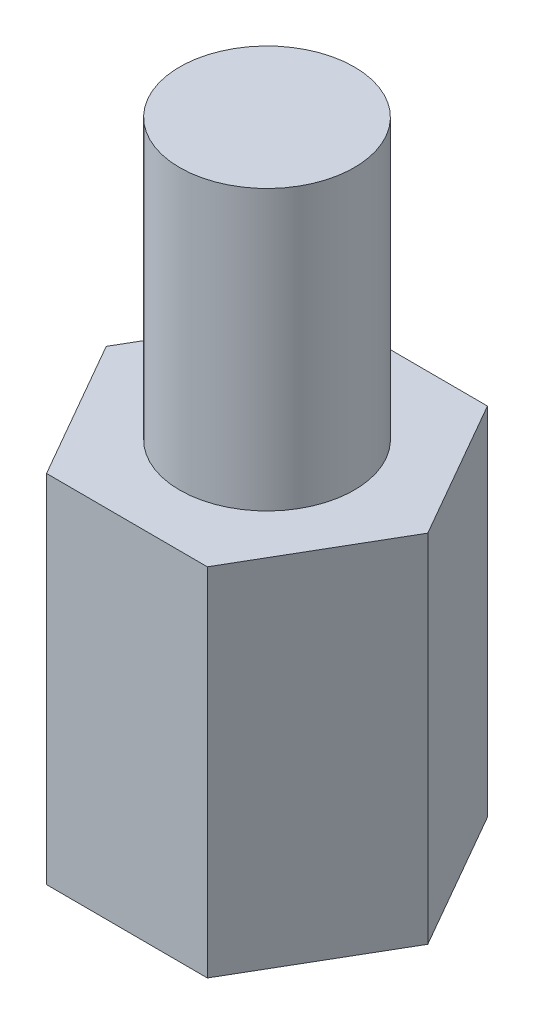
ISO-10303-21;
HEADER;
FILE_DESCRIPTION(('STEP AP214'),'2;1');
FILE_NAME('part.step','',(''),(''),'','','');
FILE_SCHEMA(('AUTOMOTIVE_DESIGN { 1 0 10303 214 1 1 1 1 }'));
ENDSEC;
DATA;
#1=APPLICATION_CONTEXT('core data for automotive mechanical design processes');
#2=APPLICATION_PROTOCOL_DEFINITION('international standard','automotive_design',2000,#1);
#3=PRODUCT_CONTEXT('',#1,'mechanical');
#4=PRODUCT('Part','Part','',(#3));
#5=PRODUCT_RELATED_PRODUCT_CATEGORY('part','',(#4));
#6=PRODUCT_DEFINITION_FORMATION('','',#4);
#7=PRODUCT_DEFINITION_CONTEXT('part definition',#1,'design');
#8=PRODUCT_DEFINITION('design','',#6,#7);
#9=PRODUCT_DEFINITION_SHAPE('','',#8);
#10=(LENGTH_UNIT() NAMED_UNIT(*) SI_UNIT(.MILLI.,.METRE.));
#11=(NAMED_UNIT(*) PLANE_ANGLE_UNIT() SI_UNIT($,.RADIAN.));
#12=(NAMED_UNIT(*) SI_UNIT($,.STERADIAN.) SOLID_ANGLE_UNIT());
#13=UNCERTAINTY_MEASURE_WITH_UNIT(LENGTH_MEASURE(1.E-05),#10,'distance_accuracy_value','');
#14=(GEOMETRIC_REPRESENTATION_CONTEXT(3) GLOBAL_UNCERTAINTY_ASSIGNED_CONTEXT((#13)) GLOBAL_UNIT_ASSIGNED_CONTEXT((#10,
#11,#12)) REPRESENTATION_CONTEXT('',''));
#15=CARTESIAN_POINT('',(0.,0.,0.));
#16=DIRECTION('',(0.,0.,1.));
#17=DIRECTION('',(1.,0.,0.));
#18=AXIS2_PLACEMENT_3D('',#15,#16,#17);
#19=CARTESIAN_POINT('',(2.30939087048754,5.1,0.00686590431880863));
#20=DIRECTION('',(-0.86750808832284,0.,0.497423076157965));
#21=DIRECTION('',(0.497423076157965,0.,0.86750808832284));
#22=AXIS2_PLACEMENT_3D('',#19,#20,#21);
#23=PLANE('',#22);
#24=DIRECTION('',(-0.497423076157965,0.,-0.867508088322839));
#25=VECTOR('',#24,1.);
#26=CARTESIAN_POINT('',(2.30939087048754,0.,0.00686590431880863));
#27=LINE('',#26,#25);
#28=CARTESIAN_POINT('',(2.30939087048754,0.,0.00686590431880863));
#29=VERTEX_POINT('',#28);
#30=CARTESIAN_POINT('',(1.16064148280381,0.,-1.99655820895067));
#31=VERTEX_POINT('',#30);
#32=EDGE_CURVE('E119',#29,#31,#27,.T.);
#33=ORIENTED_EDGE('',*,*,#32,.T.);
#34=DIRECTION('',(0.,-1.,0.));
#35=VECTOR('',#34,1.);
#36=CARTESIAN_POINT('',(1.16064148280381,5.1,-1.99655820895067));
#37=LINE('',#36,#35);
#38=CARTESIAN_POINT('',(1.16064148280381,5.1,-1.99655820895067));
#39=VERTEX_POINT('',#38);
#40=EDGE_CURVE('E36',#39,#31,#37,.T.);
#41=ORIENTED_EDGE('',*,*,#40,.F.);
#42=DIRECTION('',(-0.497423076157965,0.,-0.867508088322839));
#43=VECTOR('',#42,1.);
#44=CARTESIAN_POINT('',(2.30939087048754,5.1,0.00686590431880863));
#45=LINE('',#44,#43);
#46=CARTESIAN_POINT('',(2.30939087048754,5.1,0.00686590431880863));
#47=VERTEX_POINT('',#46);
#48=EDGE_CURVE('E130',#47,#39,#45,.T.);
#49=ORIENTED_EDGE('',*,*,#48,.F.);
#50=DIRECTION('',(0.,-1.,0.));
#51=VECTOR('',#50,1.);
#52=CARTESIAN_POINT('',(2.30939087048754,5.1,0.00686590431880863));
#53=LINE('',#52,#51);
#54=EDGE_CURVE('E115',#47,#29,#53,.T.);
#55=ORIENTED_EDGE('',*,*,#54,.T.);
#56=EDGE_LOOP('',(#33,#41,#49,#55));
#57=FACE_BOUND('',#56,.T.);
#58=ADVANCED_FACE('F33',(#57),#23,.F.);
#59=CARTESIAN_POINT('',(1.16064148280381,5.1,-1.99655820895067));
#60=DIRECTION('',(-0.00297302378002078,0.,0.999995580555036));
#61=DIRECTION('',(0.999995580555036,0.,0.00297302378002079));
#62=AXIS2_PLACEMENT_3D('',#59,#60,#61);
#63=PLANE('',#62);
#64=DIRECTION('',(-0.999995580555036,0.,-0.00297302378002078));
#65=VECTOR('',#64,1.);
#66=CARTESIAN_POINT('',(1.16064148280381,0.,-1.99655820895067));
#67=LINE('',#66,#65);
#68=CARTESIAN_POINT('',(-1.14874938768373,0.,-2.00342411326948));
#69=VERTEX_POINT('',#68);
#70=EDGE_CURVE('E122',#31,#69,#67,.T.);
#71=ORIENTED_EDGE('',*,*,#70,.T.);
#72=DIRECTION('',(0.,-1.,0.));
#73=VECTOR('',#72,1.);
#74=CARTESIAN_POINT('',(-1.14874938768373,5.1,-2.00342411326948));
#75=LINE('',#74,#73);
#76=CARTESIAN_POINT('',(-1.14874938768373,5.1,-2.00342411326948));
#77=VERTEX_POINT('',#76);
#78=EDGE_CURVE('E133',#77,#69,#75,.T.);
#79=ORIENTED_EDGE('',*,*,#78,.F.);
#80=DIRECTION('',(-0.999995580555036,0.,-0.00297302378002078));
#81=VECTOR('',#80,1.);
#82=CARTESIAN_POINT('',(1.16064148280381,5.1,-1.99655820895067));
#83=LINE('',#82,#81);
#84=EDGE_CURVE('E88',#39,#77,#83,.T.);
#85=ORIENTED_EDGE('',*,*,#84,.F.);
#86=ORIENTED_EDGE('',*,*,#40,.T.);
#87=EDGE_LOOP('',(#71,#79,#85,#86));
#88=FACE_BOUND('',#87,.T.);
#89=ADVANCED_FACE('F138',(#88),#63,.F.);
#90=CARTESIAN_POINT('',(-1.14874938768373,5.1,-2.00342411326948));
#91=DIRECTION('',(0.864535064542819,0.,0.502572504397071));
#92=DIRECTION('',(0.502572504397071,0.,-0.864535064542819));
#93=AXIS2_PLACEMENT_3D('',#90,#91,#92);
#94=PLANE('',#93);
#95=DIRECTION('',(-0.502572504397071,0.,0.864535064542819));
#96=VECTOR('',#95,1.);
#97=CARTESIAN_POINT('',(-1.14874938768373,0.,-2.00342411326948));
#98=LINE('',#97,#96);
#99=CARTESIAN_POINT('',(-2.30939087048754,0.,-0.00686590431880733));
#100=VERTEX_POINT('',#99);
#101=EDGE_CURVE('E125',#69,#100,#98,.T.);
#102=ORIENTED_EDGE('',*,*,#101,.T.);
#103=DIRECTION('',(0.,-1.,0.));
#104=VECTOR('',#103,1.);
#105=CARTESIAN_POINT('',(-2.30939087048754,5.1,-0.00686590431880733));
#106=LINE('',#105,#104);
#107=CARTESIAN_POINT('',(-2.30939087048754,5.1,-0.00686590431880733));
#108=VERTEX_POINT('',#107);
#109=EDGE_CURVE('E110',#108,#100,#106,.T.);
#110=ORIENTED_EDGE('',*,*,#109,.F.);
#111=DIRECTION('',(-0.502572504397071,0.,0.864535064542819));
#112=VECTOR('',#111,1.);
#113=CARTESIAN_POINT('',(-1.14874938768373,5.1,-2.00342411326948));
#114=LINE('',#113,#112);
#115=EDGE_CURVE('E101',#77,#108,#114,.T.);
#116=ORIENTED_EDGE('',*,*,#115,.F.);
#117=ORIENTED_EDGE('',*,*,#78,.T.);
#118=EDGE_LOOP('',(#102,#110,#116,#117));
#119=FACE_BOUND('',#118,.T.);
#120=ADVANCED_FACE('F144',(#119),#94,.F.);
#121=CARTESIAN_POINT('',(-2.30939087048754,5.1,-0.00686590431880733));
#122=DIRECTION('',(0.867508088322839,0.,-0.497423076157965));
#123=DIRECTION('',(-0.497423076157965,0.,-0.867508088322839));
#124=AXIS2_PLACEMENT_3D('',#121,#122,#123);
#125=PLANE('',#124);
#126=DIRECTION('',(0.497423076157965,0.,0.867508088322839));
#127=VECTOR('',#126,1.);
#128=CARTESIAN_POINT('',(-2.30939087048754,0.,-0.00686590431880733));
#129=LINE('',#128,#127);
#130=CARTESIAN_POINT('',(-1.16064148280381,0.,1.99655820895067));
#131=VERTEX_POINT('',#130);
#132=EDGE_CURVE('E109',#100,#131,#129,.T.);
#133=ORIENTED_EDGE('',*,*,#132,.T.);
#134=DIRECTION('',(0.,-1.,0.));
#135=VECTOR('',#134,1.);
#136=CARTESIAN_POINT('',(-1.16064148280381,5.1,1.99655820895067));
#137=LINE('',#136,#135);
#138=CARTESIAN_POINT('',(-1.16064148280381,5.1,1.99655820895067));
#139=VERTEX_POINT('',#138);
#140=EDGE_CURVE('E106',#139,#131,#137,.T.);
#141=ORIENTED_EDGE('',*,*,#140,.F.);
#142=DIRECTION('',(0.497423076157965,0.,0.867508088322839));
#143=VECTOR('',#142,1.);
#144=CARTESIAN_POINT('',(-2.30939087048754,5.1,-0.00686590431880733));
#145=LINE('',#144,#143);
#146=EDGE_CURVE('E95',#108,#139,#145,.T.);
#147=ORIENTED_EDGE('',*,*,#146,.F.);
#148=ORIENTED_EDGE('',*,*,#109,.T.);
#149=EDGE_LOOP('',(#133,#141,#147,#148));
#150=FACE_BOUND('',#149,.T.);
#151=ADVANCED_FACE('F107',(#150),#125,.F.);
#152=CARTESIAN_POINT('',(-1.16064148280381,5.1,1.99655820895067));
#153=DIRECTION('',(0.0029730237800206,0.,-0.999995580555036));
#154=DIRECTION('',(-0.999995580555036,0.,-0.0029730237800206));
#155=AXIS2_PLACEMENT_3D('',#152,#153,#154);
#156=PLANE('',#155);
#157=DIRECTION('',(0.999995580555036,0.,0.0029730237800206));
#158=VECTOR('',#157,1.);
#159=CARTESIAN_POINT('',(-1.16064148280381,0.,1.99655820895067));
#160=LINE('',#159,#158);
#161=CARTESIAN_POINT('',(1.14874938768373,0.,2.00342411326948));
#162=VERTEX_POINT('',#161);
#163=EDGE_CURVE('E73',#131,#162,#160,.T.);
#164=ORIENTED_EDGE('',*,*,#163,.T.);
#165=DIRECTION('',(0.,-1.,0.));
#166=VECTOR('',#165,1.);
#167=CARTESIAN_POINT('',(1.14874938768373,5.1,2.00342411326948));
#168=LINE('',#167,#166);
#169=CARTESIAN_POINT('',(1.14874938768373,5.1,2.00342411326948));
#170=VERTEX_POINT('',#169);
#171=EDGE_CURVE('E111',#170,#162,#168,.T.);
#172=ORIENTED_EDGE('',*,*,#171,.F.);
#173=DIRECTION('',(0.999995580555036,0.,0.0029730237800206));
#174=VECTOR('',#173,1.);
#175=CARTESIAN_POINT('',(-1.16064148280381,5.1,1.99655820895067));
#176=LINE('',#175,#174);
#177=EDGE_CURVE('E99',#139,#170,#176,.T.);
#178=ORIENTED_EDGE('',*,*,#177,.F.);
#179=ORIENTED_EDGE('',*,*,#140,.T.);
#180=EDGE_LOOP('',(#164,#172,#178,#179));
#181=FACE_BOUND('',#180,.T.);
#182=ADVANCED_FACE('F113',(#181),#156,.F.);
#183=CARTESIAN_POINT('',(1.14874938768373,5.1,2.00342411326948));
#184=DIRECTION('',(-0.864535064542819,0.,-0.502572504397071));
#185=DIRECTION('',(-0.502572504397071,0.,0.864535064542819));
#186=AXIS2_PLACEMENT_3D('',#183,#184,#185);
#187=PLANE('',#186);
#188=DIRECTION('',(0.502572504397071,0.,-0.864535064542819));
#189=VECTOR('',#188,1.);
#190=CARTESIAN_POINT('',(1.14874938768373,0.,2.00342411326948));
#191=LINE('',#190,#189);
#192=EDGE_CURVE('E79',#162,#29,#191,.T.);
#193=ORIENTED_EDGE('',*,*,#192,.T.);
#194=ORIENTED_EDGE('',*,*,#54,.F.);
#195=DIRECTION('',(0.502572504397071,0.,-0.864535064542819));
#196=VECTOR('',#195,1.);
#197=CARTESIAN_POINT('',(1.14874938768373,5.1,2.00342411326948));
#198=LINE('',#197,#196);
#199=EDGE_CURVE('E50',#170,#47,#198,.T.);
#200=ORIENTED_EDGE('',*,*,#199,.F.);
#201=ORIENTED_EDGE('',*,*,#171,.T.);
#202=EDGE_LOOP('',(#193,#194,#200,#201));
#203=FACE_BOUND('',#202,.T.);
#204=ADVANCED_FACE('F177',(#203),#187,.F.);
#205=CARTESIAN_POINT('',(0.,5.1,0.));
#206=DIRECTION('',(0.,1.,0.));
#207=DIRECTION('',(0.,0.,1.));
#208=AXIS2_PLACEMENT_3D('',#205,#206,#207);
#209=PLANE('',#208);
#210=CARTESIAN_POINT('',(0.,5.1,0.));
#211=DIRECTION('',(0.,1.,0.));
#212=DIRECTION('',(0.,0.,1.));
#213=AXIS2_PLACEMENT_3D('',#210,#211,#212);
#214=CIRCLE('',#213,1.25);
#215=CARTESIAN_POINT('',(0.,5.1,1.25));
#216=VERTEX_POINT('',#215);
#217=EDGE_CURVE('E11',#216,#216,#214,.T.);
#218=ORIENTED_EDGE('',*,*,#217,.F.);
#219=EDGE_LOOP('',(#218));
#220=FACE_BOUND('',#219,.T.);
#221=ORIENTED_EDGE('',*,*,#48,.T.);
#222=ORIENTED_EDGE('',*,*,#84,.T.);
#223=ORIENTED_EDGE('',*,*,#115,.T.);
#224=ORIENTED_EDGE('',*,*,#146,.T.);
#225=ORIENTED_EDGE('',*,*,#177,.T.);
#226=ORIENTED_EDGE('',*,*,#199,.T.);
#227=EDGE_LOOP('',(#221,#222,#223,#224,#225,#226));
#228=FACE_BOUND('',#227,.T.);
#229=ADVANCED_FACE('F97',(#220,#228),#209,.T.);
#230=CARTESIAN_POINT('',(0.,0.,0.));
#231=DIRECTION('',(0.,1.,0.));
#232=DIRECTION('',(0.,0.,1.));
#233=AXIS2_PLACEMENT_3D('',#230,#231,#232);
#234=PLANE('',#233);
#235=CARTESIAN_POINT('',(0.,0.,0.));
#236=DIRECTION('',(0.,-1.,0.));
#237=DIRECTION('',(0.,0.,-1.));
#238=AXIS2_PLACEMENT_3D('',#235,#236,#237);
#239=CIRCLE('',#238,1.27);
#240=CARTESIAN_POINT('',(0.,0.,-1.27));
#241=VERTEX_POINT('',#240);
#242=EDGE_CURVE('E151',#241,#241,#239,.T.);
#243=ORIENTED_EDGE('',*,*,#242,.F.);
#244=EDGE_LOOP('',(#243));
#245=FACE_BOUND('',#244,.T.);
#246=ORIENTED_EDGE('',*,*,#32,.F.);
#247=ORIENTED_EDGE('',*,*,#192,.F.);
#248=ORIENTED_EDGE('',*,*,#163,.F.);
#249=ORIENTED_EDGE('',*,*,#132,.F.);
#250=ORIENTED_EDGE('',*,*,#101,.F.);
#251=ORIENTED_EDGE('',*,*,#70,.F.);
#252=EDGE_LOOP('',(#246,#247,#248,#249,#250,#251));
#253=FACE_BOUND('',#252,.T.);
#254=ADVANCED_FACE('F143',(#245,#253),#234,.F.);
#255=CARTESIAN_POINT('',(0.,9.1,0.));
#256=DIRECTION('',(0.,-1.,0.));
#257=DIRECTION('',(0.,0.,-1.));
#258=AXIS2_PLACEMENT_3D('',#255,#256,#257);
#259=CYLINDRICAL_SURFACE('',#258,1.25);
#260=CARTESIAN_POINT('',(0.,9.1,0.));
#261=DIRECTION('',(0.,1.,0.));
#262=DIRECTION('',(0.,0.,1.));
#263=AXIS2_PLACEMENT_3D('',#260,#261,#262);
#264=CIRCLE('',#263,1.25);
#265=CARTESIAN_POINT('',(0.,9.1,1.25));
#266=VERTEX_POINT('',#265);
#267=EDGE_CURVE('E123',#266,#266,#264,.T.);
#268=ORIENTED_EDGE('',*,*,#267,.F.);
#269=EDGE_LOOP('',(#268));
#270=FACE_BOUND('',#269,.T.);
#271=ORIENTED_EDGE('',*,*,#217,.T.);
#272=EDGE_LOOP('',(#271));
#273=FACE_BOUND('',#272,.T.);
#274=ADVANCED_FACE('F167',(#270,#273),#259,.T.);
#275=CARTESIAN_POINT('',(0.,9.1,0.));
#276=DIRECTION('',(0.,1.,0.));
#277=DIRECTION('',(0.,0.,1.));
#278=AXIS2_PLACEMENT_3D('',#275,#276,#277);
#279=PLANE('',#278);
#280=ORIENTED_EDGE('',*,*,#267,.T.);
#281=EDGE_LOOP('',(#280));
#282=FACE_BOUND('',#281,.T.);
#283=ADVANCED_FACE('F162',(#282),#279,.T.);
#284=CARTESIAN_POINT('',(0.,2.,0.));
#285=DIRECTION('',(0.,-1.,0.));
#286=DIRECTION('',(0.,0.,-1.));
#287=AXIS2_PLACEMENT_3D('',#284,#285,#286);
#288=CYLINDRICAL_SURFACE('',#287,1.27);
#289=CARTESIAN_POINT('',(0.,2.,0.));
#290=DIRECTION('',(0.,-1.,0.));
#291=DIRECTION('',(0.,0.,-1.));
#292=AXIS2_PLACEMENT_3D('',#289,#290,#291);
#293=CIRCLE('',#292,1.27);
#294=CARTESIAN_POINT('',(0.,2.,-1.27));
#295=VERTEX_POINT('',#294);
#296=EDGE_CURVE('E150',#295,#295,#293,.T.);
#297=ORIENTED_EDGE('',*,*,#296,.F.);
#298=EDGE_LOOP('',(#297));
#299=FACE_BOUND('',#298,.T.);
#300=ORIENTED_EDGE('',*,*,#242,.T.);
#301=EDGE_LOOP('',(#300));
#302=FACE_BOUND('',#301,.T.);
#303=ADVANCED_FACE('F159',(#299,#302),#288,.F.);
#304=CARTESIAN_POINT('',(0.,2.,0.));
#305=DIRECTION('',(0.,-1.,0.));
#306=DIRECTION('',(0.,0.,-1.));
#307=AXIS2_PLACEMENT_3D('',#304,#305,#306);
#308=PLANE('',#307);
#309=ORIENTED_EDGE('',*,*,#296,.T.);
#310=EDGE_LOOP('',(#309));
#311=FACE_BOUND('',#310,.T.);
#312=ADVANCED_FACE('F157',(#311),#308,.T.);
#313=CLOSED_SHELL('',(#58,#89,#120,#151,#182,#204,#229,#254,#274,#283,#303,#312));
#314=MANIFOLD_SOLID_BREP('B2',#313);
#315=ADVANCED_BREP_SHAPE_REPRESENTATION('',(#18,#314),#14);
#316=SHAPE_DEFINITION_REPRESENTATION(#9,#315);
ENDSEC;
END-ISO-10303-21;
